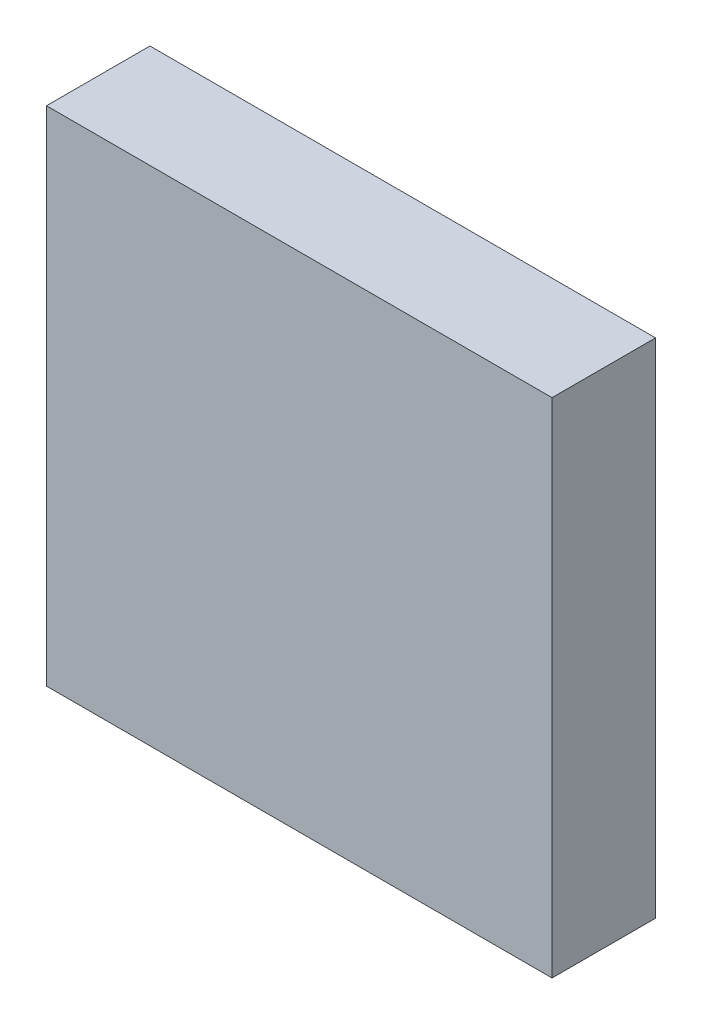
ISO-10303-21;
HEADER;
FILE_DESCRIPTION(('STEP AP214'),'2;1');
FILE_NAME('part.step','',(''),(''),'','','');
FILE_SCHEMA(('AUTOMOTIVE_DESIGN { 1 0 10303 214 1 1 1 1 }'));
ENDSEC;
DATA;
#1=APPLICATION_CONTEXT('core data for automotive mechanical design processes');
#2=APPLICATION_PROTOCOL_DEFINITION('international standard','automotive_design',2000,#1);
#3=PRODUCT_CONTEXT('',#1,'mechanical');
#4=PRODUCT('Part','Part','',(#3));
#5=PRODUCT_RELATED_PRODUCT_CATEGORY('part','',(#4));
#6=PRODUCT_DEFINITION_FORMATION('','',#4);
#7=PRODUCT_DEFINITION_CONTEXT('part definition',#1,'design');
#8=PRODUCT_DEFINITION('design','',#6,#7);
#9=PRODUCT_DEFINITION_SHAPE('','',#8);
#10=(LENGTH_UNIT() NAMED_UNIT(*) SI_UNIT(.MILLI.,.METRE.));
#11=(NAMED_UNIT(*) PLANE_ANGLE_UNIT() SI_UNIT($,.RADIAN.));
#12=(NAMED_UNIT(*) SI_UNIT($,.STERADIAN.) SOLID_ANGLE_UNIT());
#13=UNCERTAINTY_MEASURE_WITH_UNIT(LENGTH_MEASURE(1.E-05),#10,'distance_accuracy_value','');
#14=(GEOMETRIC_REPRESENTATION_CONTEXT(3) GLOBAL_UNCERTAINTY_ASSIGNED_CONTEXT((#13)) GLOBAL_UNIT_ASSIGNED_CONTEXT((#10,
#11,#12)) REPRESENTATION_CONTEXT('',''));
#15=CARTESIAN_POINT('',(0.,0.,0.));
#16=DIRECTION('',(0.,0.,1.));
#17=DIRECTION('',(1.,0.,0.));
#18=AXIS2_PLACEMENT_3D('',#15,#16,#17);
#19=CARTESIAN_POINT('',(-50.6308614344562,1700.,-275.863389703693));
#20=DIRECTION('',(1.,0.,0.));
#21=DIRECTION('',(0.,0.,-1.));
#22=AXIS2_PLACEMENT_3D('',#19,#20,#21);
#23=PLANE('',#22);
#24=DIRECTION('',(0.,0.,1.));
#25=VECTOR('',#24,1.);
#26=CARTESIAN_POINT('',(-50.6308614344562,0.,-275.863389703693));
#27=LINE('',#26,#25);
#28=CARTESIAN_POINT('',(-50.6308614344562,0.,-275.863389703693));
#29=VERTEX_POINT('',#28);
#30=CARTESIAN_POINT('',(-50.6308614344562,0.,74.136610296307));
#31=VERTEX_POINT('',#30);
#32=EDGE_CURVE('E96',#29,#31,#27,.T.);
#33=ORIENTED_EDGE('',*,*,#32,.T.);
#34=DIRECTION('',(0.,-1.,0.));
#35=VECTOR('',#34,1.);
#36=CARTESIAN_POINT('',(-50.6308614344562,1700.,74.136610296307));
#37=LINE('',#36,#35);
#38=CARTESIAN_POINT('',(-50.6308614344562,1700.,74.136610296307));
#39=VERTEX_POINT('',#38);
#40=EDGE_CURVE('E11',#39,#31,#37,.T.);
#41=ORIENTED_EDGE('',*,*,#40,.F.);
#42=DIRECTION('',(0.,0.,1.));
#43=VECTOR('',#42,1.);
#44=CARTESIAN_POINT('',(-50.6308614344562,1700.,-275.863389703693));
#45=LINE('',#44,#43);
#46=CARTESIAN_POINT('',(-50.6308614344562,1700.,-275.863389703693));
#47=VERTEX_POINT('',#46);
#48=EDGE_CURVE('E84',#47,#39,#45,.T.);
#49=ORIENTED_EDGE('',*,*,#48,.F.);
#50=DIRECTION('',(0.,-1.,0.));
#51=VECTOR('',#50,1.);
#52=CARTESIAN_POINT('',(-50.6308614344562,1700.,-275.863389703693));
#53=LINE('',#52,#51);
#54=EDGE_CURVE('E92',#47,#29,#53,.T.);
#55=ORIENTED_EDGE('',*,*,#54,.T.);
#56=EDGE_LOOP('',(#33,#41,#49,#55));
#57=FACE_BOUND('',#56,.T.);
#58=ADVANCED_FACE('F33',(#57),#23,.F.);
#59=CARTESIAN_POINT('',(-50.6308614344562,1700.,74.136610296307));
#60=DIRECTION('',(0.,0.,-1.));
#61=DIRECTION('',(-1.,0.,0.));
#62=AXIS2_PLACEMENT_3D('',#59,#60,#61);
#63=PLANE('',#62);
#64=DIRECTION('',(1.,0.,0.));
#65=VECTOR('',#64,1.);
#66=CARTESIAN_POINT('',(-50.6308614344562,0.,74.136610296307));
#67=LINE('',#66,#65);
#68=CARTESIAN_POINT('',(1659.36913856554,0.,74.136610296307));
#69=VERTEX_POINT('',#68);
#70=EDGE_CURVE('E88',#31,#69,#67,.T.);
#71=ORIENTED_EDGE('',*,*,#70,.T.);
#72=DIRECTION('',(0.,-1.,0.));
#73=VECTOR('',#72,1.);
#74=CARTESIAN_POINT('',(1659.36913856554,1700.,74.136610296307));
#75=LINE('',#74,#73);
#76=CARTESIAN_POINT('',(1659.36913856554,1700.,74.136610296307));
#77=VERTEX_POINT('',#76);
#78=EDGE_CURVE('E41',#77,#69,#75,.T.);
#79=ORIENTED_EDGE('',*,*,#78,.F.);
#80=DIRECTION('',(1.,0.,0.));
#81=VECTOR('',#80,1.);
#82=CARTESIAN_POINT('',(-50.6308614344562,1700.,74.136610296307));
#83=LINE('',#82,#81);
#84=EDGE_CURVE('E79',#39,#77,#83,.T.);
#85=ORIENTED_EDGE('',*,*,#84,.F.);
#86=ORIENTED_EDGE('',*,*,#40,.T.);
#87=EDGE_LOOP('',(#71,#79,#85,#86));
#88=FACE_BOUND('',#87,.T.);
#89=ADVANCED_FACE('F87',(#88),#63,.F.);
#90=CARTESIAN_POINT('',(1659.36913856554,1700.,-275.863389703693));
#91=DIRECTION('',(-1.,0.,0.));
#92=DIRECTION('',(0.,0.,1.));
#93=AXIS2_PLACEMENT_3D('',#90,#91,#92);
#94=PLANE('',#93);
#95=DIRECTION('',(0.,0.,-1.));
#96=VECTOR('',#95,1.);
#97=CARTESIAN_POINT('',(1659.36913856554,0.,-275.863389703693));
#98=LINE('',#97,#96);
#99=CARTESIAN_POINT('',(1659.36913856554,0.,-275.863389703693));
#100=VERTEX_POINT('',#99);
#101=EDGE_CURVE('E66',#69,#100,#98,.T.);
#102=ORIENTED_EDGE('',*,*,#101,.T.);
#103=DIRECTION('',(0.,-1.,0.));
#104=VECTOR('',#103,1.);
#105=CARTESIAN_POINT('',(1659.36913856554,1700.,-275.863389703693));
#106=LINE('',#105,#104);
#107=CARTESIAN_POINT('',(1659.36913856554,1700.,-275.863389703693));
#108=VERTEX_POINT('',#107);
#109=EDGE_CURVE('E89',#108,#100,#106,.T.);
#110=ORIENTED_EDGE('',*,*,#109,.F.);
#111=DIRECTION('',(0.,0.,-1.));
#112=VECTOR('',#111,1.);
#113=CARTESIAN_POINT('',(1659.36913856554,1700.,-275.863389703693));
#114=LINE('',#113,#112);
#115=EDGE_CURVE('E82',#77,#108,#114,.T.);
#116=ORIENTED_EDGE('',*,*,#115,.F.);
#117=ORIENTED_EDGE('',*,*,#78,.T.);
#118=EDGE_LOOP('',(#102,#110,#116,#117));
#119=FACE_BOUND('',#118,.T.);
#120=ADVANCED_FACE('F90',(#119),#94,.F.);
#121=CARTESIAN_POINT('',(-50.6308614344562,1700.,-275.863389703693));
#122=DIRECTION('',(0.,0.,1.));
#123=DIRECTION('',(1.,0.,0.));
#124=AXIS2_PLACEMENT_3D('',#121,#122,#123);
#125=PLANE('',#124);
#126=DIRECTION('',(-1.,0.,0.));
#127=VECTOR('',#126,1.);
#128=CARTESIAN_POINT('',(-50.6308614344562,0.,-275.863389703693));
#129=LINE('',#128,#127);
#130=EDGE_CURVE('E72',#100,#29,#129,.T.);
#131=ORIENTED_EDGE('',*,*,#130,.T.);
#132=ORIENTED_EDGE('',*,*,#54,.F.);
#133=DIRECTION('',(-1.,0.,0.));
#134=VECTOR('',#133,1.);
#135=CARTESIAN_POINT('',(-50.6308614344562,1700.,-275.863389703693));
#136=LINE('',#135,#134);
#137=EDGE_CURVE('E49',#108,#47,#136,.T.);
#138=ORIENTED_EDGE('',*,*,#137,.F.);
#139=ORIENTED_EDGE('',*,*,#109,.T.);
#140=EDGE_LOOP('',(#131,#132,#138,#139));
#141=FACE_BOUND('',#140,.T.);
#142=ADVANCED_FACE('F103',(#141),#125,.F.);
#143=CARTESIAN_POINT('',(0.,1700.,0.));
#144=DIRECTION('',(0.,1.,0.));
#145=DIRECTION('',(0.,0.,1.));
#146=AXIS2_PLACEMENT_3D('',#143,#144,#145);
#147=PLANE('',#146);
#148=ORIENTED_EDGE('',*,*,#48,.T.);
#149=ORIENTED_EDGE('',*,*,#84,.T.);
#150=ORIENTED_EDGE('',*,*,#115,.T.);
#151=ORIENTED_EDGE('',*,*,#137,.T.);
#152=EDGE_LOOP('',(#148,#149,#150,#151));
#153=FACE_BOUND('',#152,.T.);
#154=ADVANCED_FACE('F80',(#153),#147,.T.);
#155=CARTESIAN_POINT('',(0.,0.,0.));
#156=DIRECTION('',(0.,1.,0.));
#157=DIRECTION('',(0.,0.,1.));
#158=AXIS2_PLACEMENT_3D('',#155,#156,#157);
#159=PLANE('',#158);
#160=ORIENTED_EDGE('',*,*,#32,.F.);
#161=ORIENTED_EDGE('',*,*,#130,.F.);
#162=ORIENTED_EDGE('',*,*,#101,.F.);
#163=ORIENTED_EDGE('',*,*,#70,.F.);
#164=EDGE_LOOP('',(#160,#161,#162,#163));
#165=FACE_BOUND('',#164,.T.);
#166=ADVANCED_FACE('F106',(#165),#159,.F.);
#167=CLOSED_SHELL('',(#58,#89,#120,#142,#154,#166));
#168=MANIFOLD_SOLID_BREP('B2',#167);
#169=ADVANCED_BREP_SHAPE_REPRESENTATION('',(#18,#168),#14);
#170=SHAPE_DEFINITION_REPRESENTATION(#9,#169);
ENDSEC;
END-ISO-10303-21;
